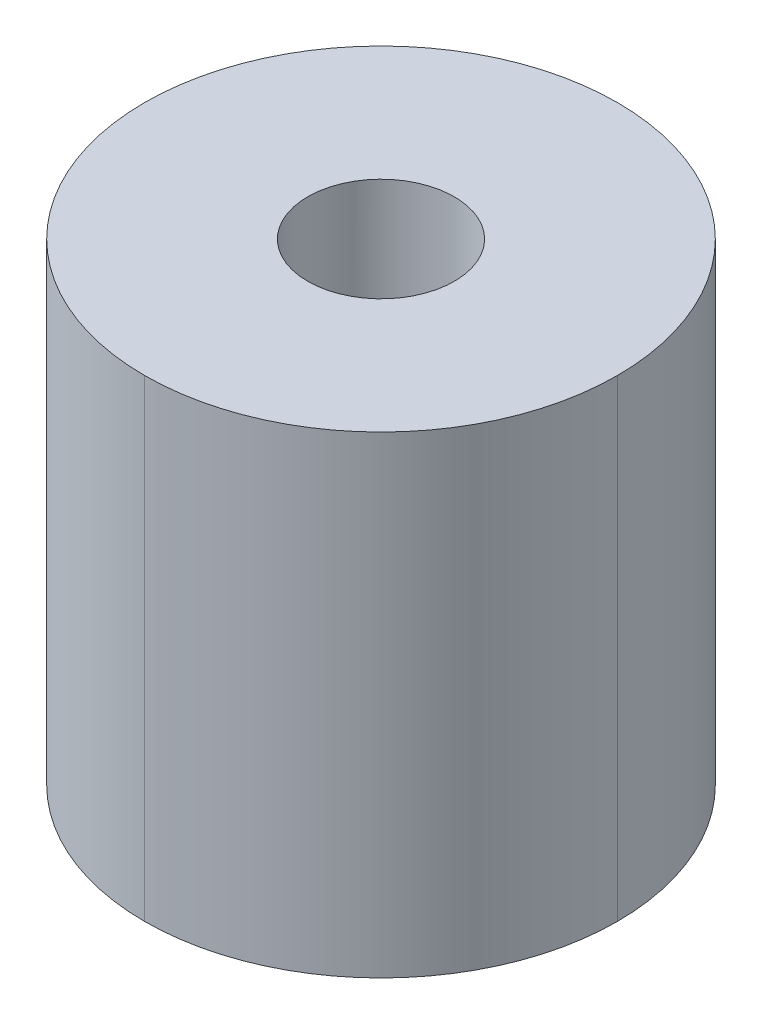
ISO-10303-21;
HEADER;
FILE_DESCRIPTION(('STEP AP214'),'2;1');
FILE_NAME('part.step','',(''),(''),'','','');
FILE_SCHEMA(('AUTOMOTIVE_DESIGN { 1 0 10303 214 1 1 1 1 }'));
ENDSEC;
DATA;
#1=APPLICATION_CONTEXT('core data for automotive mechanical design processes');
#2=APPLICATION_PROTOCOL_DEFINITION('international standard','automotive_design',2000,#1);
#3=PRODUCT_CONTEXT('',#1,'mechanical');
#4=PRODUCT('Part','Part','',(#3));
#5=PRODUCT_RELATED_PRODUCT_CATEGORY('part','',(#4));
#6=PRODUCT_DEFINITION_FORMATION('','',#4);
#7=PRODUCT_DEFINITION_CONTEXT('part definition',#1,'design');
#8=PRODUCT_DEFINITION('design','',#6,#7);
#9=PRODUCT_DEFINITION_SHAPE('','',#8);
#10=(LENGTH_UNIT() NAMED_UNIT(*) SI_UNIT(.MILLI.,.METRE.));
#11=(NAMED_UNIT(*) PLANE_ANGLE_UNIT() SI_UNIT($,.RADIAN.));
#12=(NAMED_UNIT(*) SI_UNIT($,.STERADIAN.) SOLID_ANGLE_UNIT());
#13=UNCERTAINTY_MEASURE_WITH_UNIT(LENGTH_MEASURE(1.E-05),#10,'distance_accuracy_value','');
#14=(GEOMETRIC_REPRESENTATION_CONTEXT(3) GLOBAL_UNCERTAINTY_ASSIGNED_CONTEXT((#13)) GLOBAL_UNIT_ASSIGNED_CONTEXT((#10,
#11,#12)) REPRESENTATION_CONTEXT('',''));
#15=CARTESIAN_POINT('',(0.,0.,0.));
#16=DIRECTION('',(0.,0.,1.));
#17=DIRECTION('',(1.,0.,0.));
#18=AXIS2_PLACEMENT_3D('',#15,#16,#17);
#19=CARTESIAN_POINT('',(0.,0.,0.));
#20=DIRECTION('',(0.,1.,0.));
#21=DIRECTION('',(0.,0.,1.));
#22=AXIS2_PLACEMENT_3D('',#19,#20,#21);
#23=CYLINDRICAL_SURFACE('',#22,3.1);
#24=CARTESIAN_POINT('',(0.,12.3,0.));
#25=DIRECTION('',(0.,-1.,0.));
#26=DIRECTION('',(0.,0.,-1.));
#27=AXIS2_PLACEMENT_3D('',#24,#25,#26);
#28=CIRCLE('',#27,3.1);
#29=CARTESIAN_POINT('',(0.,12.3,-3.1));
#30=VERTEX_POINT('',#29);
#31=EDGE_CURVE('E115',#30,#30,#28,.T.);
#32=ORIENTED_EDGE('',*,*,#31,.T.);
#33=EDGE_LOOP('',(#32));
#34=FACE_BOUND('',#33,.T.);
#35=CARTESIAN_POINT('',(0.,20.,0.));
#36=DIRECTION('',(0.,1.,0.));
#37=DIRECTION('',(0.,0.,1.));
#38=AXIS2_PLACEMENT_3D('',#35,#36,#37);
#39=CIRCLE('',#38,3.1);
#40=CARTESIAN_POINT('',(0.,20.,3.1));
#41=VERTEX_POINT('',#40);
#42=EDGE_CURVE('E110',#41,#41,#39,.T.);
#43=ORIENTED_EDGE('',*,*,#42,.T.);
#44=EDGE_LOOP('',(#43));
#45=FACE_BOUND('',#44,.T.);
#46=ADVANCED_FACE('F37',(#34,#45),#23,.F.);
#47=CARTESIAN_POINT('',(0.,20.,0.));
#48=DIRECTION('',(0.,-1.,0.));
#49=DIRECTION('',(0.,0.,-1.));
#50=AXIS2_PLACEMENT_3D('',#47,#48,#49);
#51=PLANE('',#50);
#52=ORIENTED_EDGE('',*,*,#42,.F.);
#53=EDGE_LOOP('',(#52));
#54=FACE_BOUND('',#53,.T.);
#55=CARTESIAN_POINT('',(0.,20.,0.));
#56=DIRECTION('',(0.,-1.,0.));
#57=DIRECTION('',(0.,0.,-1.));
#58=AXIS2_PLACEMENT_3D('',#55,#56,#57);
#59=CIRCLE('',#58,10.);
#60=CARTESIAN_POINT('',(-10.,20.,0.));
#61=VERTEX_POINT('',#60);
#62=CARTESIAN_POINT('',(0.,20.,10.));
#63=VERTEX_POINT('',#62);
#64=EDGE_CURVE('E53',#61,#63,#59,.F.);
#65=ORIENTED_EDGE('',*,*,#64,.T.);
#66=CARTESIAN_POINT('',(0.,20.,0.));
#67=DIRECTION('',(0.,-1.,0.));
#68=DIRECTION('',(0.,0.,-1.));
#69=AXIS2_PLACEMENT_3D('',#66,#67,#68);
#70=CIRCLE('',#69,10.);
#71=CARTESIAN_POINT('',(10.,20.,0.));
#72=VERTEX_POINT('',#71);
#73=EDGE_CURVE('E11',#63,#72,#70,.F.);
#74=ORIENTED_EDGE('',*,*,#73,.T.);
#75=CARTESIAN_POINT('',(0.,20.,0.));
#76=DIRECTION('',(0.,-1.,0.));
#77=DIRECTION('',(0.,0.,-1.));
#78=AXIS2_PLACEMENT_3D('',#75,#76,#77);
#79=CIRCLE('',#78,10.);
#80=CARTESIAN_POINT('',(0.,20.,-10.));
#81=VERTEX_POINT('',#80);
#82=EDGE_CURVE('E46',#72,#81,#79,.F.);
#83=ORIENTED_EDGE('',*,*,#82,.T.);
#84=CARTESIAN_POINT('',(0.,20.,0.));
#85=DIRECTION('',(0.,-1.,0.));
#86=DIRECTION('',(0.,0.,-1.));
#87=AXIS2_PLACEMENT_3D('',#84,#85,#86);
#88=CIRCLE('',#87,10.);
#89=EDGE_CURVE('E58',#81,#61,#88,.F.);
#90=ORIENTED_EDGE('',*,*,#89,.T.);
#91=EDGE_LOOP('',(#65,#74,#83,#90));
#92=FACE_BOUND('',#91,.T.);
#93=ADVANCED_FACE('F126',(#54,#92),#51,.F.);
#94=CARTESIAN_POINT('',(0.,0.,0.));
#95=DIRECTION('',(0.,-1.,0.));
#96=DIRECTION('',(0.,0.,-1.));
#97=AXIS2_PLACEMENT_3D('',#94,#95,#96);
#98=PLANE('',#97);
#99=CARTESIAN_POINT('',(0.,0.,0.));
#100=DIRECTION('',(0.,-1.,0.));
#101=DIRECTION('',(0.,0.,-1.));
#102=AXIS2_PLACEMENT_3D('',#99,#100,#101);
#103=CIRCLE('',#102,5.075);
#104=CARTESIAN_POINT('',(0.,0.,-5.075));
#105=VERTEX_POINT('',#104);
#106=EDGE_CURVE('E107',#105,#105,#103,.T.);
#107=ORIENTED_EDGE('',*,*,#106,.F.);
#108=EDGE_LOOP('',(#107));
#109=FACE_BOUND('',#108,.T.);
#110=CARTESIAN_POINT('',(0.,0.,0.));
#111=DIRECTION('',(0.,-1.,0.));
#112=DIRECTION('',(0.,0.,-1.));
#113=AXIS2_PLACEMENT_3D('',#110,#111,#112);
#114=CIRCLE('',#113,10.);
#115=CARTESIAN_POINT('',(0.,0.,-10.));
#116=VERTEX_POINT('',#115);
#117=CARTESIAN_POINT('',(10.,0.,0.));
#118=VERTEX_POINT('',#117);
#119=EDGE_CURVE('E79',#116,#118,#114,.T.);
#120=ORIENTED_EDGE('',*,*,#119,.T.);
#121=CARTESIAN_POINT('',(0.,0.,0.));
#122=DIRECTION('',(0.,-1.,0.));
#123=DIRECTION('',(0.,0.,-1.));
#124=AXIS2_PLACEMENT_3D('',#121,#122,#123);
#125=CIRCLE('',#124,10.);
#126=CARTESIAN_POINT('',(0.,0.,10.));
#127=VERTEX_POINT('',#126);
#128=EDGE_CURVE('E83',#118,#127,#125,.T.);
#129=ORIENTED_EDGE('',*,*,#128,.T.);
#130=CARTESIAN_POINT('',(0.,0.,0.));
#131=DIRECTION('',(0.,-1.,0.));
#132=DIRECTION('',(0.,0.,-1.));
#133=AXIS2_PLACEMENT_3D('',#130,#131,#132);
#134=CIRCLE('',#133,10.);
#135=CARTESIAN_POINT('',(-10.,0.,0.));
#136=VERTEX_POINT('',#135);
#137=EDGE_CURVE('E123',#127,#136,#134,.T.);
#138=ORIENTED_EDGE('',*,*,#137,.T.);
#139=CARTESIAN_POINT('',(0.,0.,0.));
#140=DIRECTION('',(0.,-1.,0.));
#141=DIRECTION('',(0.,0.,-1.));
#142=AXIS2_PLACEMENT_3D('',#139,#140,#141);
#143=CIRCLE('',#142,10.);
#144=EDGE_CURVE('E85',#136,#116,#143,.T.);
#145=ORIENTED_EDGE('',*,*,#144,.T.);
#146=EDGE_LOOP('',(#120,#129,#138,#145));
#147=FACE_BOUND('',#146,.T.);
#148=ADVANCED_FACE('F81',(#109,#147),#98,.T.);
#149=CARTESIAN_POINT('',(0.,9.3,0.));
#150=DIRECTION('',(0.,-1.,0.));
#151=DIRECTION('',(0.,0.,-1.));
#152=AXIS2_PLACEMENT_3D('',#149,#150,#151);
#153=CYLINDRICAL_SURFACE('',#152,5.075);
#154=CARTESIAN_POINT('',(0.,10.325,0.));
#155=DIRECTION('',(0.,-1.,0.));
#156=DIRECTION('',(0.,0.,-1.));
#157=AXIS2_PLACEMENT_3D('',#154,#155,#156);
#158=CIRCLE('',#157,5.075);
#159=CARTESIAN_POINT('',(0.,10.325,-5.075));
#160=VERTEX_POINT('',#159);
#161=EDGE_CURVE('E120',#160,#160,#158,.F.);
#162=ORIENTED_EDGE('',*,*,#161,.T.);
#163=EDGE_LOOP('',(#162));
#164=FACE_BOUND('',#163,.T.);
#165=ORIENTED_EDGE('',*,*,#106,.T.);
#166=EDGE_LOOP('',(#165));
#167=FACE_BOUND('',#166,.T.);
#168=ADVANCED_FACE('F134',(#164,#167),#153,.F.);
#169=CARTESIAN_POINT('',(0.,9.3,0.));
#170=DIRECTION('',(0.,-1.,0.));
#171=DIRECTION('',(0.,0.,-1.));
#172=AXIS2_PLACEMENT_3D('',#169,#170,#171);
#173=CONICAL_SURFACE('',#172,6.10000000000005,0.785398163397453);
#174=ORIENTED_EDGE('',*,*,#31,.F.);
#175=EDGE_LOOP('',(#174));
#176=FACE_BOUND('',#175,.T.);
#177=ORIENTED_EDGE('',*,*,#161,.F.);
#178=EDGE_LOOP('',(#177));
#179=FACE_BOUND('',#178,.T.);
#180=ADVANCED_FACE('F143',(#176,#179),#173,.F.);
#181=CARTESIAN_POINT('',(0.,20.,0.));
#182=DIRECTION('',(0.,-1.,0.));
#183=DIRECTION('',(0.,0.,-1.));
#184=AXIS2_PLACEMENT_3D('',#181,#182,#183);
#185=CYLINDRICAL_SURFACE('',#184,10.);
#186=DIRECTION('',(0.,-1.,0.));
#187=VECTOR('',#186,1.);
#188=CARTESIAN_POINT('',(0.,20.,-10.));
#189=LINE('',#188,#187);
#190=EDGE_CURVE('E105',#116,#81,#189,.F.);
#191=ORIENTED_EDGE('',*,*,#190,.F.);
#192=ORIENTED_EDGE('',*,*,#144,.F.);
#193=DIRECTION('',(0.,-1.,0.));
#194=VECTOR('',#193,1.);
#195=CARTESIAN_POINT('',(-10.,20.,0.));
#196=LINE('',#195,#194);
#197=EDGE_CURVE('E41',#61,#136,#196,.T.);
#198=ORIENTED_EDGE('',*,*,#197,.F.);
#199=ORIENTED_EDGE('',*,*,#89,.F.);
#200=EDGE_LOOP('',(#191,#192,#198,#199));
#201=FACE_BOUND('',#200,.T.);
#202=ADVANCED_FACE('F39',(#201),#185,.T.);
#203=CARTESIAN_POINT('',(0.,20.,0.));
#204=DIRECTION('',(0.,-1.,0.));
#205=DIRECTION('',(0.,0.,-1.));
#206=AXIS2_PLACEMENT_3D('',#203,#204,#205);
#207=CYLINDRICAL_SURFACE('',#206,10.);
#208=ORIENTED_EDGE('',*,*,#197,.T.);
#209=ORIENTED_EDGE('',*,*,#137,.F.);
#210=DIRECTION('',(0.,-1.,0.));
#211=VECTOR('',#210,1.);
#212=CARTESIAN_POINT('',(0.,20.,10.));
#213=LINE('',#212,#211);
#214=EDGE_CURVE('E95',#63,#127,#213,.T.);
#215=ORIENTED_EDGE('',*,*,#214,.F.);
#216=ORIENTED_EDGE('',*,*,#64,.F.);
#217=EDGE_LOOP('',(#208,#209,#215,#216));
#218=FACE_BOUND('',#217,.T.);
#219=ADVANCED_FACE('F125',(#218),#207,.T.);
#220=CARTESIAN_POINT('',(0.,20.,0.));
#221=DIRECTION('',(0.,-1.,0.));
#222=DIRECTION('',(0.,0.,-1.));
#223=AXIS2_PLACEMENT_3D('',#220,#221,#222);
#224=CYLINDRICAL_SURFACE('',#223,10.);
#225=ORIENTED_EDGE('',*,*,#190,.T.);
#226=ORIENTED_EDGE('',*,*,#82,.F.);
#227=DIRECTION('',(0.,-1.,0.));
#228=VECTOR('',#227,1.);
#229=CARTESIAN_POINT('',(10.,20.,0.));
#230=LINE('',#229,#228);
#231=EDGE_CURVE('E91',#118,#72,#230,.F.);
#232=ORIENTED_EDGE('',*,*,#231,.F.);
#233=ORIENTED_EDGE('',*,*,#119,.F.);
#234=EDGE_LOOP('',(#225,#226,#232,#233));
#235=FACE_BOUND('',#234,.T.);
#236=ADVANCED_FACE('F92',(#235),#224,.T.);
#237=CARTESIAN_POINT('',(0.,20.,0.));
#238=DIRECTION('',(0.,-1.,0.));
#239=DIRECTION('',(0.,0.,-1.));
#240=AXIS2_PLACEMENT_3D('',#237,#238,#239);
#241=CYLINDRICAL_SURFACE('',#240,10.);
#242=ORIENTED_EDGE('',*,*,#73,.F.);
#243=ORIENTED_EDGE('',*,*,#214,.T.);
#244=ORIENTED_EDGE('',*,*,#128,.F.);
#245=ORIENTED_EDGE('',*,*,#231,.T.);
#246=EDGE_LOOP('',(#242,#243,#244,#245));
#247=FACE_BOUND('',#246,.T.);
#248=ADVANCED_FACE('F97',(#247),#241,.T.);
#249=CLOSED_SHELL('',(#46,#93,#148,#168,#180,#202,#219,#236,#248));
#250=MANIFOLD_SOLID_BREP('B2',#249);
#251=ADVANCED_BREP_SHAPE_REPRESENTATION('',(#18,#250),#14);
#252=SHAPE_DEFINITION_REPRESENTATION(#9,#251);
ENDSEC;
END-ISO-10303-21;
